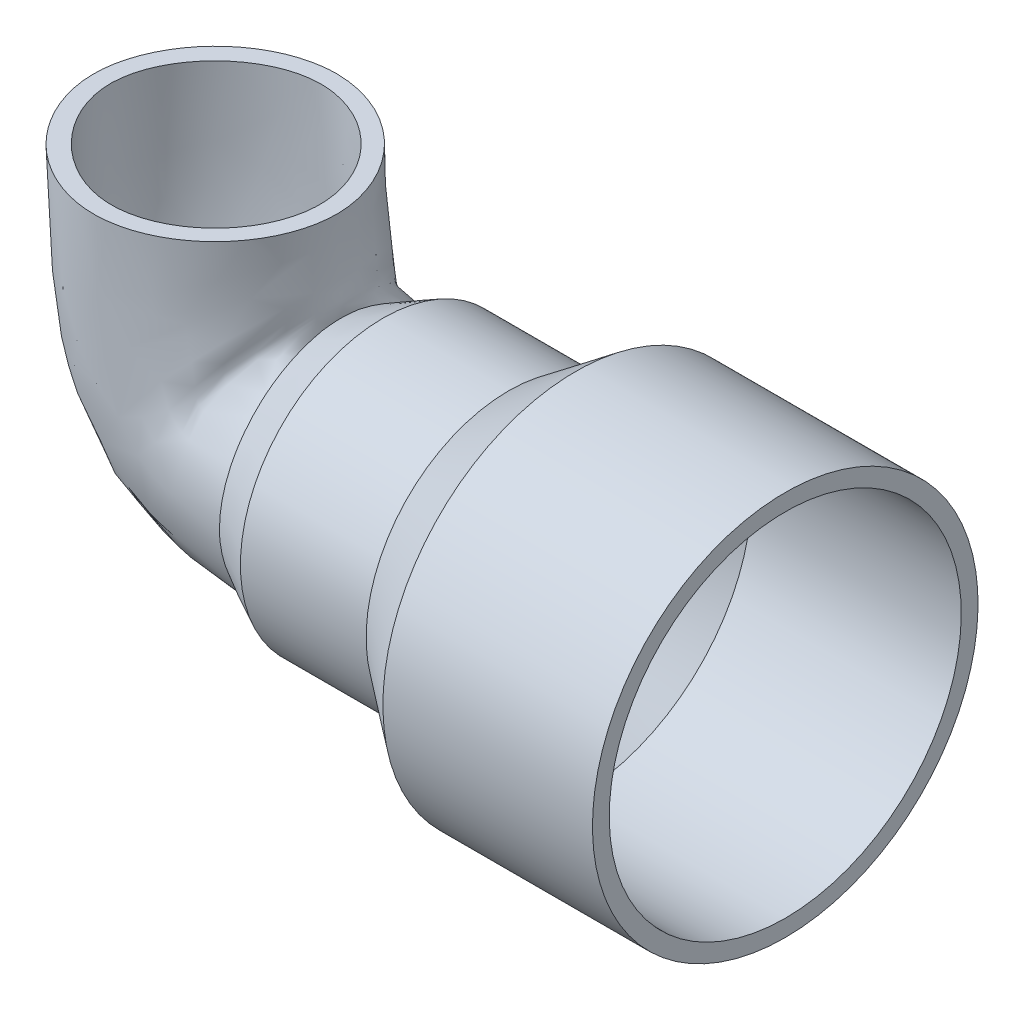
ISO-10303-21;
HEADER;
FILE_DESCRIPTION(('STEP AP214'),'2;1');
FILE_NAME('part.step','',(''),(''),'','','');
FILE_SCHEMA(('AUTOMOTIVE_DESIGN { 1 0 10303 214 1 1 1 1 }'));
ENDSEC;
DATA;
#1=APPLICATION_CONTEXT('core data for automotive mechanical design processes');
#2=APPLICATION_PROTOCOL_DEFINITION('international standard','automotive_design',2000,#1);
#3=PRODUCT_CONTEXT('',#1,'mechanical');
#4=PRODUCT('Part','Part','',(#3));
#5=PRODUCT_RELATED_PRODUCT_CATEGORY('part','',(#4));
#6=PRODUCT_DEFINITION_FORMATION('','',#4);
#7=PRODUCT_DEFINITION_CONTEXT('part definition',#1,'design');
#8=PRODUCT_DEFINITION('design','',#6,#7);
#9=PRODUCT_DEFINITION_SHAPE('','',#8);
#10=(LENGTH_UNIT() NAMED_UNIT(*) SI_UNIT(.MILLI.,.METRE.));
#11=(NAMED_UNIT(*) PLANE_ANGLE_UNIT() SI_UNIT($,.RADIAN.));
#12=(NAMED_UNIT(*) SI_UNIT($,.STERADIAN.) SOLID_ANGLE_UNIT());
#13=UNCERTAINTY_MEASURE_WITH_UNIT(LENGTH_MEASURE(1.E-05),#10,'distance_accuracy_value','');
#14=(GEOMETRIC_REPRESENTATION_CONTEXT(3) GLOBAL_UNCERTAINTY_ASSIGNED_CONTEXT((#13)) GLOBAL_UNIT_ASSIGNED_CONTEXT((#10,
#11,#12)) REPRESENTATION_CONTEXT('',''));
#15=CARTESIAN_POINT('',(0.,0.,0.));
#16=DIRECTION('',(0.,0.,1.));
#17=DIRECTION('',(1.,0.,0.));
#18=AXIS2_PLACEMENT_3D('',#15,#16,#17);
#19=CARTESIAN_POINT('',(-54.0909811019163,3.82106626767682,165.5));
#20=CARTESIAN_POINT('',(-54.0310372549395,1.02369924200767,165.5));
#21=CARTESIAN_POINT('',(-53.911149560986,-4.57103480933061,165.5));
#22=CARTESIAN_POINT('',(-52.629345334084,-12.3019522654296,165.5));
#23=CARTESIAN_POINT('',(-50.4057088278137,-18.0511037258101,165.5));
#24=CARTESIAN_POINT('',(-45.3207181918616,-20.6667759772876,165.5));
#25=CARTESIAN_POINT('',(-41.1675601318978,-21.0082144806449,165.5));
#26=CARTESIAN_POINT('',(-39.0909811019159,-21.1789337323236,165.5));
#27=CARTESIAN_POINT('',(-52.2247211897802,3.82106626767681,165.502112693678));
#28=CARTESIAN_POINT('',(-52.1826471418427,1.29788768821658,165.502112693678));
#29=CARTESIAN_POINT('',(-52.0984990459676,-3.7484694707039,165.502112693678));
#30=CARTESIAN_POINT('',(-50.9272942180678,-10.737597760018,165.502112693678));
#31=CARTESIAN_POINT('',(-49.5803796484308,-16.3305449875028,165.502112693678));
#32=CARTESIAN_POINT('',(-44.9275749922106,-18.8205603394971,165.502112693678));
#33=CARTESIAN_POINT('',(-41.0365123986808,-19.1486359932907,165.502112693678));
#34=CARTESIAN_POINT('',(-39.0909811019159,-19.3126738201875,165.502112693678));
#35=CARTESIAN_POINT('',(-49.4028908152659,3.82106626767681,166.146440373178));
#36=CARTESIAN_POINT('',(-49.3920612370021,1.7040867509622,166.146440373178));
#37=CARTESIAN_POINT('',(-49.3704020804747,-2.52987228246704,166.146440373178));
#38=CARTESIAN_POINT('',(-48.2254112881063,-8.33820572380235,166.146440373178));
#39=CARTESIAN_POINT('',(-48.3415181602521,-13.675620685343,166.146440373178));
#40=CARTESIAN_POINT('',(-44.3076500392752,-16.0066552098171,166.146440373178));
#41=CARTESIAN_POINT('',(-40.8298707477024,-16.3294473670545,166.146440373178));
#42=CARTESIAN_POINT('',(-39.0909811019159,-16.4908434456732,166.146440373178));
#43=CARTESIAN_POINT('',(-46.1208208950633,3.82106626767681,168.015818261705));
#44=CARTESIAN_POINT('',(-46.0802787626658,2.18016176972019,168.015818261705));
#45=CARTESIAN_POINT('',(-45.9991944978707,-1.10164722619306,168.015818261705));
#46=CARTESIAN_POINT('',(-45.751711648652,-5.98592436528117,168.015818261705));
#47=CARTESIAN_POINT('',(-44.3077479934382,-9.51084106247997,168.015818261705));
#48=CARTESIAN_POINT('',(-44.8001502158924,-13.0897001541132,168.015818261705));
#49=CARTESIAN_POINT('',(-40.9940374732414,-13.1690824016848,168.015818261705));
#50=CARTESIAN_POINT('',(-39.0909811019159,-13.2087735254706,168.015818261705));
#51=CARTESIAN_POINT('',(-41.7480524331799,3.82106626767681,171.662614315743));
#52=CARTESIAN_POINT('',(-41.7278732085778,2.75213965805734,171.662614315743));
#53=CARTESIAN_POINT('',(-41.6875147593734,0.614286438818412,171.662614315743));
#54=CARTESIAN_POINT('',(-41.6278034988023,-2.58496455646809,171.662614315743));
#55=CARTESIAN_POINT('',(-40.9347138850204,-5.21207753052342,171.662614315743));
#56=CARTESIAN_POINT('',(-41.5745157356822,-7.42790942252665,171.662614315743));
#57=CARTESIAN_POINT('',(-39.918825979838,-8.36663984990038,171.662614315743));
#58=CARTESIAN_POINT('',(-39.0909811019159,-8.83600506358723,171.662614315743));
#59=CARTESIAN_POINT('',(-37.8653240369053,3.8210662676768,180.));
#60=CARTESIAN_POINT('',(-37.8687619862568,3.09824114340324,180.));
#61=CARTESIAN_POINT('',(-37.8756378849597,1.65259089485612,180.));
#62=CARTESIAN_POINT('',(-37.6062665496293,-0.508620656871839,180.));
#63=CARTESIAN_POINT('',(-37.9018715933014,-2.34103187686233,180.));
#64=CARTESIAN_POINT('',(-36.6607330392985,-3.69078077673289,180.));
#65=CARTESIAN_POINT('',(-38.2808984143768,-4.53244470378602,180.));
#66=CARTESIAN_POINT('',(-39.0909811019159,-4.95327666731258,180.));
#67=CARTESIAN_POINT('',(-41.74805243318,3.8210662676768,188.337385684257));
#68=CARTESIAN_POINT('',(-41.7278732085695,2.75213965805774,188.337385684257));
#69=CARTESIAN_POINT('',(-41.6875147593487,0.614286438819609,188.337385684257));
#70=CARTESIAN_POINT('',(-41.6278034986661,-2.58496455643608,188.337385684257));
#71=CARTESIAN_POINT('',(-40.9347138849777,-5.21207753054738,188.337385684257));
#72=CARTESIAN_POINT('',(-41.5745157352457,-7.42790942237626,188.337385684257));
#73=CARTESIAN_POINT('',(-39.9188259796925,-8.36663984985024,188.337385684257));
#74=CARTESIAN_POINT('',(-39.0909811019159,-8.83600506358722,188.337385684257));
#75=CARTESIAN_POINT('',(-46.1208208950633,3.82106626767681,191.984181738295));
#76=CARTESIAN_POINT('',(-46.0802787626445,2.1801617697291,191.984181738295));
#77=CARTESIAN_POINT('',(-45.9991944978069,-1.10164722616631,191.984181738295));
#78=CARTESIAN_POINT('',(-45.7517116484983,-5.98592436521994,191.984181738295));
#79=CARTESIAN_POINT('',(-44.3077479931209,-9.51084106234392,191.984181738295));
#80=CARTESIAN_POINT('',(-44.8001502160003,-13.0897001541543,191.984181738295));
#81=CARTESIAN_POINT('',(-40.9940374732774,-13.1690824016985,191.984181738295));
#82=CARTESIAN_POINT('',(-39.0909811019159,-13.2087735254706,191.984181738295));
#83=CARTESIAN_POINT('',(-49.4028908152659,3.82106626767681,193.853559626822));
#84=CARTESIAN_POINT('',(-49.3920612369885,1.70408675096915,193.853559626822));
#85=CARTESIAN_POINT('',(-49.3704020804339,-2.52987228244618,193.853559626822));
#86=CARTESIAN_POINT('',(-48.2254112877266,-8.33820572361328,193.853559626822));
#87=CARTESIAN_POINT('',(-48.3415181604193,-13.6756206854134,193.853559626822));
#88=CARTESIAN_POINT('',(-44.3076500392163,-16.0066552097949,193.853559626822));
#89=CARTESIAN_POINT('',(-40.8298707476827,-16.3294473670471,193.853559626822));
#90=CARTESIAN_POINT('',(-39.0909811019159,-16.4908434456732,193.853559626822));
#91=CARTESIAN_POINT('',(-55.9871616891326,3.82106626767682,195.35699087899));
#92=CARTESIAN_POINT('',(-55.9034283482378,0.756288937923784,195.35699087899));
#93=CARTESIAN_POINT('',(-55.7359616664481,-5.37326572158228,195.35699087899));
#94=CARTESIAN_POINT('',(-54.5298047911839,-13.9367871415105,195.35699087899));
#95=CARTESIAN_POINT('',(-51.2321949659366,-19.8704440570311,195.35699087899));
#96=CARTESIAN_POINT('',(-45.7541415961569,-22.5724338457473,195.35699087899));
#97=CARTESIAN_POINT('',(-41.3120345999962,-22.907554161609,195.35699087899));
#98=CARTESIAN_POINT('',(-39.0909811019159,-23.0751143195399,195.35699087899));
#99=CARTESIAN_POINT('',(-65.1688578744117,3.82106626767683,191.093163420818));
#100=CARTESIAN_POINT('',(-65.0253740123928,-0.648544003542584,191.093163420818));
#101=CARTESIAN_POINT('',(-64.738406288355,-9.5877645459814,191.093163420818));
#102=CARTESIAN_POINT('',(-62.0480186653125,-21.4061578148045,191.093163420818));
#103=CARTESIAN_POINT('',(-55.3530560688982,-27.9793297839257,191.093163420818));
#104=CARTESIAN_POINT('',(-47.5184565713121,-31.5063008813918,191.093163420818));
#105=CARTESIAN_POINT('',(-41.9001395917146,-32.0066406303433,191.093163420818));
#106=CARTESIAN_POINT('',(-39.0909811019159,-32.256810504819,191.093163420818));
#107=CARTESIAN_POINT('',(-70.3020427156686,3.82106626767683,180.));
#108=CARTESIAN_POINT('',(-70.1328932660323,-1.45567807179847,180.));
#109=CARTESIAN_POINT('',(-69.7945943667597,-12.0091667507491,180.));
#110=CARTESIAN_POINT('',(-65.791463900737,-25.180019077184,180.));
#111=CARTESIAN_POINT('',(-57.6663406902442,-32.5539246486005,180.));
#112=CARTESIAN_POINT('',(-48.6963146336488,-36.5486388293174,180.));
#113=CARTESIAN_POINT('',(-42.2927589458269,-37.1095431738231,180.));
#114=CARTESIAN_POINT('',(-39.0909811019159,-37.3899953460759,180.));
#115=CARTESIAN_POINT('',(-65.1688578744117,3.82106626767683,168.906836579182));
#116=CARTESIAN_POINT('',(-65.0253740124796,-0.648544003606967,168.906836579182));
#117=CARTESIAN_POINT('',(-64.7384062886153,-9.58776454617456,168.906836579182));
#118=CARTESIAN_POINT('',(-62.0480186651829,-21.4061578147085,168.906836579182));
#119=CARTESIAN_POINT('',(-55.3530560688869,-27.9793297839269,168.906836579182));
#120=CARTESIAN_POINT('',(-47.5184565713208,-31.5063008813938,168.906836579182));
#121=CARTESIAN_POINT('',(-41.9001395917176,-32.0066406303439,168.906836579182));
#122=CARTESIAN_POINT('',(-39.0909811019159,-32.256810504819,168.906836579182));
#123=CARTESIAN_POINT('',(-57.8235009261884,3.82106626767682,165.495774612645));
#124=CARTESIAN_POINT('',(-57.7278174811333,0.475322349589872,165.495774612645));
#125=CARTESIAN_POINT('',(-57.5364505910229,-6.21616548658402,165.495774612645));
#126=CARTESIAN_POINT('',(-56.0334475661164,-15.4306612762529,165.495774612645));
#127=CARTESIAN_POINT('',(-52.0563671865794,-21.4922212024247,165.495774612645));
#128=CARTESIAN_POINT('',(-46.1070045911636,-24.3592072528685,165.495774612645));
#129=CARTESIAN_POINT('',(-41.4296555983318,-24.7273714553533,165.495774612645));
#130=CARTESIAN_POINT('',(-39.0909811019159,-24.9114535565957,165.495774612645));
#131=CARTESIAN_POINT('',(-54.0909811019163,3.82106626767682,165.5));
#132=CARTESIAN_POINT('',(-54.0310372549395,1.02369924200767,165.5));
#133=CARTESIAN_POINT('',(-53.911149560986,-4.57103480933061,165.5));
#134=CARTESIAN_POINT('',(-52.629345334084,-12.3019522654296,165.5));
#135=CARTESIAN_POINT('',(-50.4057088278137,-18.0511037258101,165.5));
#136=CARTESIAN_POINT('',(-45.3207181918616,-20.6667759772876,165.5));
#137=CARTESIAN_POINT('',(-41.1675601318978,-21.0082144806449,165.5));
#138=CARTESIAN_POINT('',(-39.0909811019159,-21.1789337323236,165.5));
#139=B_SPLINE_SURFACE_WITH_KNOTS('',3,3,((#19,#20,#21,#22,#23,#24,#25,#26),(#27,#28,#29,#30,#31,
#32,#33,#34),(#35,#36,#37,#38,#39,#40,#41,#42),(#43,#44,#45,#46,#47,#48,#49,#50),(#51,#52,#53,
#54,#55,#56,#57,#58),(#59,#60,#61,#62,#63,#64,#65,#66),(#67,#68,#69,#70,#71,#72,#73,#74),(#75,
#76,#77,#78,#79,#80,#81,#82),(#83,#84,#85,#86,#87,#88,#89,#90),(#91,#92,#93,#94,#95,#96,#97,
#98),(#99,#100,#101,#102,#103,#104,#105,#106),(#107,#108,#109,#110,#111,#112,#113,#114),(#115,
#116,#117,#118,#119,#120,#121,#122),(#123,#124,#125,#126,#127,#128,#129,#130),(#131,#132,#133,
#134,#135,#136,#137,#138)),.UNSPECIFIED.,.T.,.F.,.F.,(4,1,1,1,1,1,1,1,1,1,1,1,4),(4,1,1,1,1,4),
(0.,0.0625,0.09375,0.125,0.25,0.375,0.40625,0.4375,0.5,0.625,0.75,0.875,1.),(0.,0.25,0.5,0.75,
0.875,1.),.UNSPECIFIED.);
#140=CARTESIAN_POINT('',(-54.0909811019163,3.82106626767682,165.5));
#141=CARTESIAN_POINT('',(-52.2247211897802,3.82106626767681,165.502112693678));
#142=CARTESIAN_POINT('',(-49.4028908152659,3.82106626767681,166.146440373178));
#143=CARTESIAN_POINT('',(-46.1208208950633,3.82106626767681,168.015818261705));
#144=CARTESIAN_POINT('',(-41.7480524331799,3.82106626767681,171.662614315743));
#145=CARTESIAN_POINT('',(-37.8653240369053,3.8210662676768,180.));
#146=CARTESIAN_POINT('',(-41.74805243318,3.8210662676768,188.337385684257));
#147=CARTESIAN_POINT('',(-46.1208208950633,3.82106626767681,191.984181738295));
#148=CARTESIAN_POINT('',(-49.4028908152659,3.82106626767681,193.853559626822));
#149=CARTESIAN_POINT('',(-55.9871616891326,3.82106626767682,195.35699087899));
#150=CARTESIAN_POINT('',(-65.1688578744117,3.82106626767683,191.093163420818));
#151=CARTESIAN_POINT('',(-70.3020427156686,3.82106626767683,180.));
#152=CARTESIAN_POINT('',(-65.1688578744117,3.82106626767683,168.906836579182));
#153=CARTESIAN_POINT('',(-57.8235009261884,3.82106626767682,165.495774612645));
#154=CARTESIAN_POINT('',(-54.0909811019163,3.82106626767682,165.5));
#155=B_SPLINE_CURVE_WITH_KNOTS('',3,(#140,#141,#142,#143,#144,#145,#146,#147,#148,#149,#150,
#151,#152,#153,#154),.UNSPECIFIED.,.T.,.F.,(4,1,1,1,1,1,1,1,1,1,1,1,4),(0.,0.0625,0.09375,0.125,
0.25,0.375,0.40625,0.4375,0.5,0.625,0.75,0.875,1.),.UNSPECIFIED.);
#156=CARTESIAN_POINT('',(-54.0909811019163,3.82106626767682,165.5));
#157=VERTEX_POINT('',#156);
#158=EDGE_CURVE('E119',#157,#157,#155,.T.);
#159=CARTESIAN_POINT('',(-39.0909811019159,-21.1789337323236,165.5));
#160=CARTESIAN_POINT('',(-39.0909811019159,-24.9114535565957,165.495774612645));
#161=CARTESIAN_POINT('',(-39.0909811019159,-32.256810504819,168.906836579182));
#162=CARTESIAN_POINT('',(-39.0909811019159,-37.3899953460759,180.));
#163=CARTESIAN_POINT('',(-39.0909811019159,-32.256810504819,191.093163420818));
#164=CARTESIAN_POINT('',(-39.0909811019159,-23.0751143195399,195.35699087899));
#165=CARTESIAN_POINT('',(-39.0909811019159,-16.4908434456732,193.853559626822));
#166=CARTESIAN_POINT('',(-39.0909811019159,-13.2087735254706,191.984181738295));
#167=CARTESIAN_POINT('',(-39.0909811019159,-8.83600506358722,188.337385684257));
#168=CARTESIAN_POINT('',(-39.0909811019159,-4.95327666731258,180.));
#169=CARTESIAN_POINT('',(-39.0909811019159,-8.83600506358723,171.662614315743));
#170=CARTESIAN_POINT('',(-39.0909811019159,-13.2087735254706,168.015818261705));
#171=CARTESIAN_POINT('',(-39.0909811019159,-16.4908434456732,166.146440373178));
#172=CARTESIAN_POINT('',(-39.0909811019159,-19.3126738201875,165.502112693678));
#173=CARTESIAN_POINT('',(-39.0909811019159,-21.1789337323236,165.5));
#174=B_SPLINE_CURVE_WITH_KNOTS('',3,(#159,#160,#161,#162,#163,#164,#165,#166,#167,#168,#169,
#170,#171,#172,#173),.UNSPECIFIED.,.T.,.F.,(4,1,1,1,1,1,1,1,1,1,1,1,4),(0.,0.125,0.25,0.375,0.5,
0.5625,0.59375,0.625,0.75,0.875,0.90625,0.9375,1.),.UNSPECIFIED.);
#175=CARTESIAN_POINT('',(-39.0909811019159,-6.85748391383301,177.775915442367));
#176=VERTEX_POINT('',#175);
#177=CARTESIAN_POINT('',(-39.0909811019159,-21.2680140077665,165.500273634106));
#178=VERTEX_POINT('',#177);
#179=EDGE_CURVE('E178',#176,#178,#174,.T.);
#180=CARTESIAN_POINT('',(-39.0909811019159,-21.1789337323236,165.5));
#181=CARTESIAN_POINT('',(-39.0909811019159,-24.9114535565957,165.495774612645));
#182=CARTESIAN_POINT('',(-39.0909811019159,-32.256810504819,168.906836579182));
#183=CARTESIAN_POINT('',(-39.0909811019159,-37.3899953460759,180.));
#184=CARTESIAN_POINT('',(-39.0909811019159,-32.256810504819,191.093163420818));
#185=CARTESIAN_POINT('',(-39.0909811019159,-23.0751143195399,195.35699087899));
#186=CARTESIAN_POINT('',(-39.0909811019159,-16.4908434456732,193.853559626822));
#187=CARTESIAN_POINT('',(-39.0909811019159,-13.2087735254706,191.984181738295));
#188=CARTESIAN_POINT('',(-39.0909811019159,-8.83600506358722,188.337385684257));
#189=CARTESIAN_POINT('',(-39.0909811019159,-4.95327666731258,180.));
#190=CARTESIAN_POINT('',(-39.0909811019159,-8.83600506358723,171.662614315743));
#191=CARTESIAN_POINT('',(-39.0909811019159,-13.2087735254706,168.015818261705));
#192=CARTESIAN_POINT('',(-39.0909811019159,-16.4908434456732,166.146440373178));
#193=CARTESIAN_POINT('',(-39.0909811019159,-19.3126738201875,165.502112693678));
#194=CARTESIAN_POINT('',(-39.0909811019159,-21.1789337323236,165.5));
#195=B_SPLINE_CURVE_WITH_KNOTS('',3,(#180,#181,#182,#183,#184,#185,#186,#187,#188,#189,#190,
#191,#192,#193,#194),.UNSPECIFIED.,.T.,.F.,(4,1,1,1,1,1,1,1,1,1,1,1,4),(0.,0.125,0.25,0.375,0.5,
0.5625,0.59375,0.625,0.75,0.875,0.90625,0.9375,1.),.UNSPECIFIED.);
#196=CARTESIAN_POINT('',(-39.0909811019159,-35.6789337323236,180.));
#197=VERTEX_POINT('',#196);
#198=EDGE_CURVE('E70',#178,#197,#195,.T.);
#199=CARTESIAN_POINT('',(-39.0909811019159,-21.1789337323236,165.5));
#200=CARTESIAN_POINT('',(-39.0909811019159,-24.9114535565957,165.495774612645));
#201=CARTESIAN_POINT('',(-39.0909811019159,-32.256810504819,168.906836579182));
#202=CARTESIAN_POINT('',(-39.0909811019159,-37.3899953460759,180.));
#203=CARTESIAN_POINT('',(-39.0909811019159,-32.256810504819,191.093163420818));
#204=CARTESIAN_POINT('',(-39.0909811019159,-23.0751143195399,195.35699087899));
#205=CARTESIAN_POINT('',(-39.0909811019159,-16.4908434456732,193.853559626822));
#206=CARTESIAN_POINT('',(-39.0909811019159,-13.2087735254706,191.984181738295));
#207=CARTESIAN_POINT('',(-39.0909811019159,-8.83600506358722,188.337385684257));
#208=CARTESIAN_POINT('',(-39.0909811019159,-4.95327666731258,180.));
#209=CARTESIAN_POINT('',(-39.0909811019159,-8.83600506358723,171.662614315743));
#210=CARTESIAN_POINT('',(-39.0909811019159,-13.2087735254706,168.015818261705));
#211=CARTESIAN_POINT('',(-39.0909811019159,-16.4908434456732,166.146440373178));
#212=CARTESIAN_POINT('',(-39.0909811019159,-19.3126738201875,165.502112693678));
#213=CARTESIAN_POINT('',(-39.0909811019159,-21.1789337323236,165.5));
#214=B_SPLINE_CURVE_WITH_KNOTS('',3,(#199,#200,#201,#202,#203,#204,#205,#206,#207,#208,#209,
#210,#211,#212,#213),.UNSPECIFIED.,.T.,.F.,(4,1,1,1,1,1,1,1,1,1,1,1,4),(0.,0.125,0.25,0.375,0.5,
0.5625,0.59375,0.625,0.75,0.875,0.90625,0.9375,1.),.UNSPECIFIED.);
#215=CARTESIAN_POINT('',(-39.0909811019159,-21.3569047651503,194.499034670768));
#216=VERTEX_POINT('',#215);
#217=EDGE_CURVE('E75',#197,#216,#214,.T.);
#218=CARTESIAN_POINT('',(-39.0909811019159,-21.1789337323236,165.5));
#219=CARTESIAN_POINT('',(-39.0909811019159,-24.9114535565957,165.495774612645));
#220=CARTESIAN_POINT('',(-39.0909811019159,-32.256810504819,168.906836579182));
#221=CARTESIAN_POINT('',(-39.0909811019159,-37.3899953460759,180.));
#222=CARTESIAN_POINT('',(-39.0909811019159,-32.256810504819,191.093163420818));
#223=CARTESIAN_POINT('',(-39.0909811019159,-23.0751143195399,195.35699087899));
#224=CARTESIAN_POINT('',(-39.0909811019159,-16.4908434456732,193.853559626822));
#225=CARTESIAN_POINT('',(-39.0909811019159,-13.2087735254706,191.984181738295));
#226=CARTESIAN_POINT('',(-39.0909811019159,-8.83600506358722,188.337385684257));
#227=CARTESIAN_POINT('',(-39.0909811019159,-4.95327666731258,180.));
#228=CARTESIAN_POINT('',(-39.0909811019159,-8.83600506358723,171.662614315743));
#229=CARTESIAN_POINT('',(-39.0909811019159,-13.2087735254706,168.015818261705));
#230=CARTESIAN_POINT('',(-39.0909811019159,-16.4908434456732,166.146440373178));
#231=CARTESIAN_POINT('',(-39.0909811019159,-19.3126738201875,165.502112693678));
#232=CARTESIAN_POINT('',(-39.0909811019159,-21.1789337323236,165.5));
#233=B_SPLINE_CURVE_WITH_KNOTS('',3,(#218,#219,#220,#221,#222,#223,#224,#225,#226,#227,#228,
#229,#230,#231,#232),.UNSPECIFIED.,.T.,.F.,(4,1,1,1,1,1,1,1,1,1,1,1,4),(0.,0.125,0.25,0.375,0.5,
0.5625,0.59375,0.625,0.75,0.875,0.90625,0.9375,1.),.UNSPECIFIED.);
#234=CARTESIAN_POINT('',(-39.0909811019159,-6.85679942850274,182.224151614657));
#235=VERTEX_POINT('',#234);
#236=EDGE_CURVE('E266',#216,#235,#233,.T.);
#237=CARTESIAN_POINT('',(-39.0909811019159,-21.1789337323236,165.5));
#238=CARTESIAN_POINT('',(-39.0909811019159,-24.9114535565957,165.495774612645));
#239=CARTESIAN_POINT('',(-39.0909811019159,-32.256810504819,168.906836579182));
#240=CARTESIAN_POINT('',(-39.0909811019159,-37.3899953460759,180.));
#241=CARTESIAN_POINT('',(-39.0909811019159,-32.256810504819,191.093163420818));
#242=CARTESIAN_POINT('',(-39.0909811019159,-23.0751143195399,195.35699087899));
#243=CARTESIAN_POINT('',(-39.0909811019159,-16.4908434456732,193.853559626822));
#244=CARTESIAN_POINT('',(-39.0909811019159,-13.2087735254706,191.984181738295));
#245=CARTESIAN_POINT('',(-39.0909811019159,-8.83600506358722,188.337385684257));
#246=CARTESIAN_POINT('',(-39.0909811019159,-4.95327666731258,180.));
#247=CARTESIAN_POINT('',(-39.0909811019159,-8.83600506358723,171.662614315743));
#248=CARTESIAN_POINT('',(-39.0909811019159,-13.2087735254706,168.015818261705));
#249=CARTESIAN_POINT('',(-39.0909811019159,-16.4908434456732,166.146440373178));
#250=CARTESIAN_POINT('',(-39.0909811019159,-19.3126738201875,165.502112693678));
#251=CARTESIAN_POINT('',(-39.0909811019159,-21.1789337323236,165.5));
#252=B_SPLINE_CURVE_WITH_KNOTS('',3,(#237,#238,#239,#240,#241,#242,#243,#244,#245,#246,#247,
#248,#249,#250,#251),.UNSPECIFIED.,.T.,.F.,(4,1,1,1,1,1,1,1,1,1,1,1,4),(0.,0.125,0.25,0.375,0.5,
0.5625,0.59375,0.625,0.75,0.875,0.90625,0.9375,1.),.UNSPECIFIED.);
#253=CARTESIAN_POINT('',(-39.0909811019159,-6.67893373232353,180.));
#254=VERTEX_POINT('',#253);
#255=EDGE_CURVE('E277',#235,#254,#252,.T.);
#256=CARTESIAN_POINT('',(-39.0909811019159,-21.1789337323236,165.5));
#257=CARTESIAN_POINT('',(-39.0909811019159,-24.9114535565957,165.495774612645));
#258=CARTESIAN_POINT('',(-39.0909811019159,-32.256810504819,168.906836579182));
#259=CARTESIAN_POINT('',(-39.0909811019159,-37.3899953460759,180.));
#260=CARTESIAN_POINT('',(-39.0909811019159,-32.256810504819,191.093163420818));
#261=CARTESIAN_POINT('',(-39.0909811019159,-23.0751143195399,195.35699087899));
#262=CARTESIAN_POINT('',(-39.0909811019159,-16.4908434456732,193.853559626822));
#263=CARTESIAN_POINT('',(-39.0909811019159,-13.2087735254706,191.984181738295));
#264=CARTESIAN_POINT('',(-39.0909811019159,-8.83600506358722,188.337385684257));
#265=CARTESIAN_POINT('',(-39.0909811019159,-4.95327666731258,180.));
#266=CARTESIAN_POINT('',(-39.0909811019159,-8.83600506358723,171.662614315743));
#267=CARTESIAN_POINT('',(-39.0909811019159,-13.2087735254706,168.015818261705));
#268=CARTESIAN_POINT('',(-39.0909811019159,-16.4908434456732,166.146440373178));
#269=CARTESIAN_POINT('',(-39.0909811019159,-19.3126738201875,165.502112693678));
#270=CARTESIAN_POINT('',(-39.0909811019159,-21.1789337323236,165.5));
#271=B_SPLINE_CURVE_WITH_KNOTS('',3,(#256,#257,#258,#259,#260,#261,#262,#263,#264,#265,#266,
#267,#268,#269,#270),.UNSPECIFIED.,.T.,.F.,(4,1,1,1,1,1,1,1,1,1,1,1,4),(0.,0.125,0.25,0.375,0.5,
0.5625,0.59375,0.625,0.75,0.875,0.90625,0.9375,1.),.UNSPECIFIED.);
#272=EDGE_CURVE('E287',#254,#176,#271,.T.);
#273=ORIENTED_EDGE('',*,*,#158,.T.);
#274=EDGE_LOOP('',(#273));
#275=FACE_BOUND('',#274,.T.);
#276=ORIENTED_EDGE('',*,*,#179,.T.);
#277=ORIENTED_EDGE('',*,*,#198,.T.);
#278=ORIENTED_EDGE('',*,*,#217,.T.);
#279=ORIENTED_EDGE('',*,*,#236,.T.);
#280=ORIENTED_EDGE('',*,*,#255,.T.);
#281=ORIENTED_EDGE('',*,*,#272,.T.);
#282=EDGE_LOOP('',(#276,#277,#278,#279,#280,#281));
#283=FACE_BOUND('',#282,.T.);
#284=ADVANCED_FACE('F50',(#275,#283),#139,.T.);
#285=CARTESIAN_POINT('',(-54.0909811019163,3.82106626767682,180.));
#286=DIRECTION('',(0.,-1.,0.));
#287=DIRECTION('',(0.,0.,-1.));
#288=AXIS2_PLACEMENT_3D('',#285,#286,#287);
#289=PLANE('',#288);
#290=CARTESIAN_POINT('',(-54.0909811019163,3.82106626767682,167.5));
#291=CARTESIAN_POINT('',(-60.4214314732741,3.82106626767682,167.576952529125));
#292=CARTESIAN_POINT('',(-72.7605307305584,3.82106626767682,180.));
#293=CARTESIAN_POINT('',(-57.3366566589531,3.82106626767682,195.528809338594));
#294=CARTESIAN_POINT('',(-44.5148551735217,3.82106626767681,189.548143190531));
#295=CARTESIAN_POINT('',(-40.1290440661136,3.8210662676768,180.));
#296=CARTESIAN_POINT('',(-44.5148551735217,3.82106626767681,170.451856809469));
#297=CARTESIAN_POINT('',(-50.9257559162374,3.82106626767681,167.461523735438));
#298=CARTESIAN_POINT('',(-54.0909811019163,3.82106626767682,167.5));
#299=B_SPLINE_CURVE_WITH_KNOTS('',3,(#290,#291,#292,#293,#294,#295,#296,#297,#298),
.UNSPECIFIED.,.T.,.F.,(4,1,1,1,1,1,4),(0.,0.25,0.5,0.625,0.75,0.875,1.),.UNSPECIFIED.);
#300=CARTESIAN_POINT('',(-54.0909811019163,3.82106626767682,167.5));
#301=VERTEX_POINT('',#300);
#302=EDGE_CURVE('E12',#301,#301,#299,.T.);
#303=ORIENTED_EDGE('',*,*,#302,.F.);
#304=EDGE_LOOP('',(#303));
#305=FACE_BOUND('',#304,.T.);
#306=ORIENTED_EDGE('',*,*,#158,.F.);
#307=EDGE_LOOP('',(#306));
#308=FACE_BOUND('',#307,.T.);
#309=ADVANCED_FACE('F151',(#305,#308),#289,.F.);
#310=CARTESIAN_POINT('',(-54.0909811019163,3.82106626767682,167.5));
#311=CARTESIAN_POINT('',(-54.0373286055782,1.01992443223443,167.5));
#312=CARTESIAN_POINT('',(-53.9300236129021,-4.58235923865033,167.5));
#313=CARTESIAN_POINT('',(-52.7832115409669,-10.9776053299807,167.5));
#314=CARTESIAN_POINT('',(-51.3989707156459,-15.8137275027879,167.5));
#315=CARTESIAN_POINT('',(-49.5285677087211,-18.2331523901842,167.5));
#316=CARTESIAN_POINT('',(-47.1456471298855,-19.6367333339243,167.5));
#317=CARTESIAN_POINT('',(-44.9960414099132,-20.4719699158593,167.5));
#318=CARTESIAN_POINT('',(-42.8147587920818,-20.9340336799027,167.5));
#319=CARTESIAN_POINT('',(-40.8074154636455,-21.1462943493364,167.5));
#320=CARTESIAN_POINT('',(-39.6631258891591,-21.1680539379945,167.5));
#321=CARTESIAN_POINT('',(-39.0909811019159,-21.1789337323236,167.5));
#322=CARTESIAN_POINT('',(-60.4214314732741,3.82106626767682,167.576952529125));
#323=CARTESIAN_POINT('',(-60.3384603710993,0.0777113765365859,167.576952529125));
#324=CARTESIAN_POINT('',(-60.1725181667496,-7.40899840574389,167.576952529125));
#325=CARTESIAN_POINT('',(-58.3282611548105,-15.694134233641,167.576952529125));
#326=CARTESIAN_POINT('',(-55.9448808454159,-21.6957870609042,167.576952529125));
#327=CARTESIAN_POINT('',(-52.8359402092542,-24.4399834896585,167.576952529125));
#328=CARTESIAN_POINT('',(-49.2095080328509,-25.9022368934461,167.576952529125));
#329=CARTESIAN_POINT('',(-45.611407137207,-26.5268830669233,167.576952529125));
#330=CARTESIAN_POINT('',(-43.1386704322073,-27.1224823634212,167.576952529125));
#331=CARTESIAN_POINT('',(-41.0951083561216,-27.4561933902202,167.576952529125));
#332=CARTESIAN_POINT('',(-39.7590235199845,-27.491653865861,167.576952529125));
#333=CARTESIAN_POINT('',(-39.0909811019159,-27.5093841036814,167.576952529125));
#334=CARTESIAN_POINT('',(-72.7605307305584,3.82106626767682,180.));
#335=CARTESIAN_POINT('',(-72.567509600478,-1.84429564311659,180.));
#336=CARTESIAN_POINT('',(-72.1814673403172,-13.1750194647034,180.));
#337=CARTESIAN_POINT('',(-68.5506049633005,-24.9025739339835,180.));
#338=CARTESIAN_POINT('',(-62.0297610688233,-31.5933788345857,180.));
#339=CARTESIAN_POINT('',(-56.7434074470403,-34.7065222406947,180.));
#340=CARTESIAN_POINT('',(-52.4873450311993,-37.0748838614224,180.));
#341=CARTESIAN_POINT('',(-49.3977542292845,-38.7542637798289,180.));
#342=CARTESIAN_POINT('',(-45.5014794090076,-39.4950005023635,180.));
#343=CARTESIAN_POINT('',(-41.8617169565603,-39.7990736494742,180.));
#344=CARTESIAN_POINT('',(-40.0145597201307,-39.8320134571352,180.));
#345=CARTESIAN_POINT('',(-39.0909811019159,-39.8484833609657,180.));
#346=CARTESIAN_POINT('',(-57.3366566589531,3.82106626767682,195.528809338594));
#347=CARTESIAN_POINT('',(-57.2811980636578,0.558213131511517,195.528809338594));
#348=CARTESIAN_POINT('',(-57.1702808730673,-5.96749314081909,195.528809338594));
#349=CARTESIAN_POINT('',(-55.7726752022308,-13.3920243082552,195.528809338594));
#350=CARTESIAN_POINT('',(-54.4236607898169,-19.2213891176045,195.528809338594));
#351=CARTESIAN_POINT('',(-51.8590733999215,-21.8733488019399,195.528809338594));
#352=CARTESIAN_POINT('',(-48.3900487833556,-23.1090751514878,195.528809338594));
#353=CARTESIAN_POINT('',(-44.6648203642221,-23.47003788871,195.528809338594));
#354=CARTESIAN_POINT('',(-42.547968188003,-24.029352828684,195.528809338594));
#355=CARTESIAN_POINT('',(-40.9034562060127,-24.3704733254069,195.528809338594));
#356=CARTESIAN_POINT('',(-39.6951394699482,-24.4065639680425,195.528809338594));
#357=CARTESIAN_POINT('',(-39.0909811019159,-24.4246092893603,195.528809338594));
#358=CARTESIAN_POINT('',(-44.5148551735217,3.82106626767681,189.548143190531));
#359=CARTESIAN_POINT('',(-44.4923273818711,2.42384878871631,189.548143190531));
#360=CARTESIAN_POINT('',(-44.4472717985699,-0.370586169204679,189.548143190531));
#361=CARTESIAN_POINT('',(-44.2486982652858,-3.84665744772259,189.548143190531));
#362=CARTESIAN_POINT('',(-43.8283705116774,-6.52400632986328,189.548143190531));
#363=CARTESIAN_POINT('',(-43.8906895168691,-8.38612487890545,189.548143190531));
#364=CARTESIAN_POINT('',(-43.8373845733788,-9.89888795681164,189.548143190531));
#365=CARTESIAN_POINT('',(-44.7118967282818,-11.4189887919334,189.548143190531));
#366=CARTESIAN_POINT('',(-42.7576377560388,-11.6502658476045,189.548143190531));
#367=CARTESIAN_POINT('',(-40.4236818288018,-11.612216332382,189.548143190531));
#368=CARTESIAN_POINT('',(-39.5352146775445,-11.60594398008,189.548143190531));
#369=CARTESIAN_POINT('',(-39.0909811019159,-11.602807803929,189.548143190531));
#370=CARTESIAN_POINT('',(-40.1290440661136,3.8210662676768,180.));
#371=CARTESIAN_POINT('',(-40.1213876949674,2.89845905943384,180.));
#372=CARTESIAN_POINT('',(-40.1060749526751,1.05324464294792,180.));
#373=CARTESIAN_POINT('',(-39.9315059792753,-1.21644853922265,180.));
#374=CARTESIAN_POINT('',(-39.7877254915127,-3.05698525601308,180.));
#375=CARTESIAN_POINT('',(-39.4939014537447,-4.10464307836539,180.));
#376=CARTESIAN_POINT('',(-39.2152410417443,-4.91219894717218,180.));
#377=CARTESIAN_POINT('',(-38.6670560485274,-5.3487127352174,180.));
#378=CARTESIAN_POINT('',(-39.0784220271267,-6.13554652147806,180.));
#379=CARTESIAN_POINT('',(-40.7903974088736,-7.07607078755348,180.));
#380=CARTESIAN_POINT('',(-39.6574532042351,-7.17002139353173,180.));
#381=CARTESIAN_POINT('',(-39.0909811019159,-7.21699669652085,180.));
#382=CARTESIAN_POINT('',(-44.5148551735217,3.82106626767681,170.451856809469));
#383=CARTESIAN_POINT('',(-44.4923273818808,2.42384878871684,170.451856809469));
#384=CARTESIAN_POINT('',(-44.447271798599,-0.370586169203104,170.451856809469));
#385=CARTESIAN_POINT('',(-44.2486982654022,-3.84665744774574,170.451856809469));
#386=CARTESIAN_POINT('',(-43.8283705119577,-6.52400632997564,170.451856809469));
#387=CARTESIAN_POINT('',(-43.8906895171015,-8.3861248789946,170.451856809469));
#388=CARTESIAN_POINT('',(-43.8373845735417,-9.89888795687461,170.451856809469));
#389=CARTESIAN_POINT('',(-44.711896728345,-11.4189887919578,170.451856809469));
#390=CARTESIAN_POINT('',(-42.7576377560309,-11.6502658476014,170.451856809469));
#391=CARTESIAN_POINT('',(-40.4236818288031,-11.6122163323825,170.451856809469));
#392=CARTESIAN_POINT('',(-39.535214677545,-11.6059439800802,170.451856809469));
#393=CARTESIAN_POINT('',(-39.0909811019159,-11.602807803929,170.451856809469));
#394=CARTESIAN_POINT('',(-50.9257559162374,3.82106626767681,167.461523735438));
#395=CARTESIAN_POINT('',(-50.8867627228177,1.49103096008336,167.461523735438));
#396=CARTESIAN_POINT('',(-50.8087763359784,-3.16903965510355,167.461523735438));
#397=CARTESIAN_POINT('',(-50.0106867340451,-8.61934087815056,167.461523735438));
#398=CARTESIAN_POINT('',(-49.1260156507609,-12.8726977237297,167.461523735438));
#399=CARTESIAN_POINT('',(-47.8748814584546,-15.129736840447,167.461523735438));
#400=CARTESIAN_POINT('',(-46.1137166784028,-16.5039815541633,167.461523735438));
#401=CARTESIAN_POINT('',(-44.6883585462663,-17.4445133403273,167.461523735438));
#402=CARTESIAN_POINT('',(-42.6528029720191,-17.8398093381435,167.461523735438));
#403=CARTESIAN_POINT('',(-40.6635690174075,-17.9913448288946,167.461523735437));
#404=CARTESIAN_POINT('',(-39.6151770737464,-18.0062539740613,167.461523735438));
#405=CARTESIAN_POINT('',(-39.0909811019159,-18.0137085466446,167.461523735438));
#406=CARTESIAN_POINT('',(-54.0909811019163,3.82106626767682,167.5));
#407=CARTESIAN_POINT('',(-54.0373286055782,1.01992443223443,167.5));
#408=CARTESIAN_POINT('',(-53.9300236129021,-4.58235923865033,167.5));
#409=CARTESIAN_POINT('',(-52.7832115409669,-10.9776053299807,167.5));
#410=CARTESIAN_POINT('',(-51.3989707156459,-15.8137275027879,167.5));
#411=CARTESIAN_POINT('',(-49.5285677087211,-18.2331523901842,167.5));
#412=CARTESIAN_POINT('',(-47.1456471298855,-19.6367333339243,167.5));
#413=CARTESIAN_POINT('',(-44.9960414099132,-20.4719699158593,167.5));
#414=CARTESIAN_POINT('',(-42.8147587920818,-20.9340336799027,167.5));
#415=CARTESIAN_POINT('',(-40.8074154636455,-21.1462943493364,167.5));
#416=CARTESIAN_POINT('',(-39.6631258891591,-21.1680539379945,167.5));
#417=CARTESIAN_POINT('',(-39.0909811019159,-21.1789337323236,167.5));
#418=B_SPLINE_SURFACE_WITH_KNOTS('',3,3,((#310,#311,#312,#313,#314,#315,#316,#317,#318,#319,
#320,#321),(#322,#323,#324,#325,#326,#327,#328,#329,#330,#331,#332,#333),(#334,#335,#336,#337,
#338,#339,#340,#341,#342,#343,#344,#345),(#346,#347,#348,#349,#350,#351,#352,#353,#354,#355,
#356,#357),(#358,#359,#360,#361,#362,#363,#364,#365,#366,#367,#368,#369),(#370,#371,#372,#373,
#374,#375,#376,#377,#378,#379,#380,#381),(#382,#383,#384,#385,#386,#387,#388,#389,#390,#391,
#392,#393),(#394,#395,#396,#397,#398,#399,#400,#401,#402,#403,#404,#405),(#406,#407,#408,#409,
#410,#411,#412,#413,#414,#415,#416,#417)),.UNSPECIFIED.,.T.,.F.,.F.,(4,1,1,1,1,1,4),(4,1,1,1,1,
1,1,1,1,4),(0.,0.25,0.5,0.625,0.75,0.875,1.),(0.,0.25,0.5,0.625,0.75,0.8125,0.875,0.9375,
0.96875,1.),.UNSPECIFIED.);
#419=CARTESIAN_POINT('',(-39.0909811019159,-21.1789337323236,167.5));
#420=CARTESIAN_POINT('',(-39.0909811019159,-18.0137085466446,167.461523735438));
#421=CARTESIAN_POINT('',(-39.0909811019159,-11.602807803929,170.451856809469));
#422=CARTESIAN_POINT('',(-39.0909811019159,-7.21699669652085,180.));
#423=CARTESIAN_POINT('',(-39.0909811019159,-11.602807803929,189.548143190531));
#424=CARTESIAN_POINT('',(-39.0909811019159,-24.4246092893603,195.528809338594));
#425=CARTESIAN_POINT('',(-39.0909811019159,-39.8484833609657,180.));
#426=CARTESIAN_POINT('',(-39.0909811019159,-27.5093841036814,167.576952529125));
#427=CARTESIAN_POINT('',(-39.0909811019159,-21.1789337323236,167.5));
#428=B_SPLINE_CURVE_WITH_KNOTS('',3,(#419,#420,#421,#422,#423,#424,#425,#426,#427),
.UNSPECIFIED.,.T.,.F.,(4,1,1,1,1,1,4),(0.,0.125,0.25,0.375,0.5,0.75,1.),.UNSPECIFIED.);
#429=CARTESIAN_POINT('',(-39.0909811019159,-20.5667908441187,167.514997753928));
#430=VERTEX_POINT('',#429);
#431=CARTESIAN_POINT('',(-39.0909811019159,-33.6789337323236,180.));
#432=VERTEX_POINT('',#431);
#433=EDGE_CURVE('E107',#430,#432,#428,.F.);
#434=CARTESIAN_POINT('',(-39.0909811019159,-21.1789337323236,167.5));
#435=CARTESIAN_POINT('',(-39.0909811019159,-18.0137085466446,167.461523735438));
#436=CARTESIAN_POINT('',(-39.0909811019159,-11.602807803929,170.451856809469));
#437=CARTESIAN_POINT('',(-39.0909811019159,-7.21699669652085,180.));
#438=CARTESIAN_POINT('',(-39.0909811019159,-11.602807803929,189.548143190531));
#439=CARTESIAN_POINT('',(-39.0909811019159,-24.4246092893603,195.528809338594));
#440=CARTESIAN_POINT('',(-39.0909811019159,-39.8484833609657,180.));
#441=CARTESIAN_POINT('',(-39.0909811019159,-27.5093841036814,167.576952529125));
#442=CARTESIAN_POINT('',(-39.0909811019159,-21.1789337323236,167.5));
#443=B_SPLINE_CURVE_WITH_KNOTS('',3,(#434,#435,#436,#437,#438,#439,#440,#441,#442),
.UNSPECIFIED.,.T.,.F.,(4,1,1,1,1,1,4),(0.,0.125,0.25,0.375,0.5,0.75,1.),.UNSPECIFIED.);
#444=CARTESIAN_POINT('',(-39.0909811019159,-8.67893373232356,180.));
#445=VERTEX_POINT('',#444);
#446=EDGE_CURVE('E63',#445,#430,#443,.F.);
#447=CARTESIAN_POINT('',(-39.0909811019159,-21.1789337323236,167.5));
#448=CARTESIAN_POINT('',(-39.0909811019159,-18.0137085466446,167.461523735438));
#449=CARTESIAN_POINT('',(-39.0909811019159,-11.602807803929,170.451856809469));
#450=CARTESIAN_POINT('',(-39.0909811019159,-7.21699669652085,180.));
#451=CARTESIAN_POINT('',(-39.0909811019159,-11.602807803929,189.548143190531));
#452=CARTESIAN_POINT('',(-39.0909811019159,-24.4246092893603,195.528809338594));
#453=CARTESIAN_POINT('',(-39.0909811019159,-39.8484833609657,180.));
#454=CARTESIAN_POINT('',(-39.0909811019159,-27.5093841036814,167.576952529125));
#455=CARTESIAN_POINT('',(-39.0909811019159,-21.1789337323236,167.5));
#456=B_SPLINE_CURVE_WITH_KNOTS('',3,(#447,#448,#449,#450,#451,#452,#453,#454,#455),
.UNSPECIFIED.,.T.,.F.,(4,1,1,1,1,1,4),(0.,0.125,0.25,0.375,0.5,0.75,1.),.UNSPECIFIED.);
#457=CARTESIAN_POINT('',(-39.0909811019159,-19.9558931733349,192.443385902027));
#458=VERTEX_POINT('',#457);
#459=EDGE_CURVE('E118',#458,#445,#456,.F.);
#460=CARTESIAN_POINT('',(-39.0909811019159,-21.1789337323236,167.5));
#461=CARTESIAN_POINT('',(-39.0909811019159,-18.0137085466446,167.461523735438));
#462=CARTESIAN_POINT('',(-39.0909811019159,-11.602807803929,170.451856809469));
#463=CARTESIAN_POINT('',(-39.0909811019159,-7.21699669652085,180.));
#464=CARTESIAN_POINT('',(-39.0909811019159,-11.602807803929,189.548143190531));
#465=CARTESIAN_POINT('',(-39.0909811019159,-24.4246092893603,195.528809338594));
#466=CARTESIAN_POINT('',(-39.0909811019159,-39.8484833609657,180.));
#467=CARTESIAN_POINT('',(-39.0909811019159,-27.5093841036814,167.576952529125));
#468=CARTESIAN_POINT('',(-39.0909811019159,-21.1789337323236,167.5));
#469=B_SPLINE_CURVE_WITH_KNOTS('',3,(#460,#461,#462,#463,#464,#465,#466,#467,#468),
.UNSPECIFIED.,.T.,.F.,(4,1,1,1,1,1,4),(0.,0.125,0.25,0.375,0.5,0.75,1.),.UNSPECIFIED.);
#470=EDGE_CURVE('E111',#432,#458,#469,.F.);
#471=ORIENTED_EDGE('',*,*,#302,.T.);
#472=EDGE_LOOP('',(#471));
#473=FACE_BOUND('',#472,.T.);
#474=ORIENTED_EDGE('',*,*,#433,.F.);
#475=ORIENTED_EDGE('',*,*,#446,.F.);
#476=ORIENTED_EDGE('',*,*,#459,.F.);
#477=ORIENTED_EDGE('',*,*,#470,.F.);
#478=EDGE_LOOP('',(#474,#475,#476,#477));
#479=FACE_BOUND('',#478,.T.);
#480=ADVANCED_FACE('F123',(#473,#479),#418,.T.);
#481=CARTESIAN_POINT('',(-34.0909811019159,-21.1789337323236,180.));
#482=DIRECTION('',(1.,0.,0.));
#483=DIRECTION('',(0.,1.,0.));
#484=AXIS2_PLACEMENT_3D('',#481,#482,#483);
#485=CONICAL_SURFACE('',#484,17.,0.463647609000807);
#486=ORIENTED_EDGE('',*,*,#217,.F.);
#487=ORIENTED_EDGE('',*,*,#198,.F.);
#488=ORIENTED_EDGE('',*,*,#179,.F.);
#489=ORIENTED_EDGE('',*,*,#272,.F.);
#490=ORIENTED_EDGE('',*,*,#255,.F.);
#491=ORIENTED_EDGE('',*,*,#236,.F.);
#492=EDGE_LOOP('',(#486,#487,#488,#489,#490,#491));
#493=FACE_BOUND('',#492,.T.);
#494=CARTESIAN_POINT('',(-34.0909811019159,-21.1789337323236,180.));
#495=DIRECTION('',(-1.,0.,0.));
#496=DIRECTION('',(0.,-1.,0.));
#497=AXIS2_PLACEMENT_3D('',#494,#495,#496);
#498=CIRCLE('',#497,17.);
#499=CARTESIAN_POINT('',(-34.0909811019159,-38.1789337323236,180.));
#500=VERTEX_POINT('',#499);
#501=EDGE_CURVE('E296',#500,#500,#498,.T.);
#502=ORIENTED_EDGE('',*,*,#501,.T.);
#503=EDGE_LOOP('',(#502));
#504=FACE_BOUND('',#503,.T.);
#505=ADVANCED_FACE('F150',(#493,#504),#485,.T.);
#506=CARTESIAN_POINT('',(-39.0909811019159,-21.1789337323236,180.));
#507=DIRECTION('',(-1.,0.,0.));
#508=DIRECTION('',(0.,-1.,0.));
#509=AXIS2_PLACEMENT_3D('',#506,#507,#508);
#510=CYLINDRICAL_SURFACE('',#509,17.);
#511=ORIENTED_EDGE('',*,*,#501,.F.);
#512=EDGE_LOOP('',(#511));
#513=FACE_BOUND('',#512,.T.);
#514=CARTESIAN_POINT('',(-19.0909811019159,-21.1789337323236,180.));
#515=DIRECTION('',(-1.,0.,0.));
#516=DIRECTION('',(0.,-1.,0.));
#517=AXIS2_PLACEMENT_3D('',#514,#515,#516);
#518=CIRCLE('',#517,17.);
#519=CARTESIAN_POINT('',(-19.0909811019159,-38.1789337323236,180.));
#520=VERTEX_POINT('',#519);
#521=EDGE_CURVE('E316',#520,#520,#518,.T.);
#522=ORIENTED_EDGE('',*,*,#521,.T.);
#523=EDGE_LOOP('',(#522));
#524=FACE_BOUND('',#523,.T.);
#525=ADVANCED_FACE('F320',(#513,#524),#510,.T.);
#526=CARTESIAN_POINT('',(-39.0909811019159,-21.1789337323236,180.));
#527=DIRECTION('',(-1.,0.,0.));
#528=DIRECTION('',(0.,-1.,0.));
#529=AXIS2_PLACEMENT_3D('',#526,#527,#528);
#530=CYLINDRICAL_SURFACE('',#529,15.);
#531=CARTESIAN_POINT('',(-19.0909811019159,-21.1789337323236,180.));
#532=DIRECTION('',(-1.,0.,0.));
#533=DIRECTION('',(0.,-1.,0.));
#534=AXIS2_PLACEMENT_3D('',#531,#532,#533);
#535=CIRCLE('',#534,15.);
#536=CARTESIAN_POINT('',(-19.0909811019159,-36.1789337323236,180.));
#537=VERTEX_POINT('',#536);
#538=EDGE_CURVE('E298',#537,#537,#535,.T.);
#539=ORIENTED_EDGE('',*,*,#538,.F.);
#540=EDGE_LOOP('',(#539));
#541=FACE_BOUND('',#540,.T.);
#542=CARTESIAN_POINT('',(-34.0909811019159,-21.1789337323236,180.));
#543=DIRECTION('',(-1.,0.,0.));
#544=DIRECTION('',(0.,-1.,0.));
#545=AXIS2_PLACEMENT_3D('',#542,#543,#544);
#546=CIRCLE('',#545,15.);
#547=CARTESIAN_POINT('',(-34.0909811019159,-36.1789337323236,180.));
#548=VERTEX_POINT('',#547);
#549=EDGE_CURVE('E125',#548,#548,#546,.T.);
#550=ORIENTED_EDGE('',*,*,#549,.T.);
#551=EDGE_LOOP('',(#550));
#552=FACE_BOUND('',#551,.T.);
#553=ADVANCED_FACE('F221',(#541,#552),#530,.F.);
#554=CARTESIAN_POINT('',(-39.0909811019159,-21.1789337323236,180.));
#555=DIRECTION('',(1.,0.,0.));
#556=DIRECTION('',(0.,1.,0.));
#557=AXIS2_PLACEMENT_3D('',#554,#555,#556);
#558=CONICAL_SURFACE('',#557,12.5,0.463647609000807);
#559=ORIENTED_EDGE('',*,*,#549,.F.);
#560=EDGE_LOOP('',(#559));
#561=FACE_BOUND('',#560,.T.);
#562=ORIENTED_EDGE('',*,*,#470,.T.);
#563=ORIENTED_EDGE('',*,*,#459,.T.);
#564=ORIENTED_EDGE('',*,*,#446,.T.);
#565=ORIENTED_EDGE('',*,*,#433,.T.);
#566=EDGE_LOOP('',(#562,#563,#564,#565));
#567=FACE_BOUND('',#566,.T.);
#568=ADVANCED_FACE('F110',(#561,#567),#558,.F.);
#569=CARTESIAN_POINT('',(-19.0909811019159,-21.1789337323236,180.));
#570=DIRECTION('',(1.,0.,0.));
#571=DIRECTION('',(0.,1.,0.));
#572=AXIS2_PLACEMENT_3D('',#569,#570,#571);
#573=CONICAL_SURFACE('',#572,15.,0.643501108793284);
#574=CARTESIAN_POINT('',(-11.0909811019159,-21.1789337323236,180.));
#575=DIRECTION('',(-1.,0.,0.));
#576=DIRECTION('',(0.,-1.,0.));
#577=AXIS2_PLACEMENT_3D('',#574,#575,#576);
#578=CIRCLE('',#577,21.);
#579=CARTESIAN_POINT('',(-11.0909811019159,-42.1789337323236,180.));
#580=VERTEX_POINT('',#579);
#581=EDGE_CURVE('E126',#580,#580,#578,.T.);
#582=ORIENTED_EDGE('',*,*,#581,.F.);
#583=EDGE_LOOP('',(#582));
#584=FACE_BOUND('',#583,.T.);
#585=ORIENTED_EDGE('',*,*,#538,.T.);
#586=EDGE_LOOP('',(#585));
#587=FACE_BOUND('',#586,.T.);
#588=ADVANCED_FACE('F220',(#584,#587),#573,.F.);
#589=CARTESIAN_POINT('',(-19.0909811019159,-21.1789337323236,180.));
#590=DIRECTION('',(-1.,0.,0.));
#591=DIRECTION('',(0.,-1.,0.));
#592=AXIS2_PLACEMENT_3D('',#589,#590,#591);
#593=CYLINDRICAL_SURFACE('',#592,21.);
#594=CARTESIAN_POINT('',(13.9090188980841,-21.1789337323236,180.));
#595=DIRECTION('',(-1.,0.,0.));
#596=DIRECTION('',(0.,-1.,0.));
#597=AXIS2_PLACEMENT_3D('',#594,#595,#596);
#598=CIRCLE('',#597,21.);
#599=CARTESIAN_POINT('',(13.9090188980841,-42.1789337323236,180.));
#600=VERTEX_POINT('',#599);
#601=EDGE_CURVE('E307',#600,#600,#598,.T.);
#602=ORIENTED_EDGE('',*,*,#601,.F.);
#603=EDGE_LOOP('',(#602));
#604=FACE_BOUND('',#603,.T.);
#605=ORIENTED_EDGE('',*,*,#581,.T.);
#606=EDGE_LOOP('',(#605));
#607=FACE_BOUND('',#606,.T.);
#608=ADVANCED_FACE('F337',(#604,#607),#593,.F.);
#609=CARTESIAN_POINT('',(13.9090188980841,1.82106626767644,180.));
#610=DIRECTION('',(-1.,0.,0.));
#611=DIRECTION('',(0.,-1.,0.));
#612=AXIS2_PLACEMENT_3D('',#609,#610,#611);
#613=PLANE('',#612);
#614=CARTESIAN_POINT('',(13.9090188980841,-21.1789337323236,180.));
#615=DIRECTION('',(-1.,0.,0.));
#616=DIRECTION('',(0.,-1.,0.));
#617=AXIS2_PLACEMENT_3D('',#614,#615,#616);
#618=CIRCLE('',#617,23.);
#619=CARTESIAN_POINT('',(13.9090188980841,-44.1789337323236,180.));
#620=VERTEX_POINT('',#619);
#621=EDGE_CURVE('E310',#620,#620,#618,.T.);
#622=ORIENTED_EDGE('',*,*,#621,.F.);
#623=EDGE_LOOP('',(#622));
#624=FACE_BOUND('',#623,.T.);
#625=ORIENTED_EDGE('',*,*,#601,.T.);
#626=EDGE_LOOP('',(#625));
#627=FACE_BOUND('',#626,.T.);
#628=ADVANCED_FACE('F331',(#624,#627),#613,.F.);
#629=CARTESIAN_POINT('',(-19.0909811019159,-21.1789337323236,180.));
#630=DIRECTION('',(-1.,0.,0.));
#631=DIRECTION('',(0.,-1.,0.));
#632=AXIS2_PLACEMENT_3D('',#629,#630,#631);
#633=CYLINDRICAL_SURFACE('',#632,23.);
#634=CARTESIAN_POINT('',(-11.0909811019159,-21.1789337323236,180.));
#635=DIRECTION('',(-1.,0.,0.));
#636=DIRECTION('',(0.,-1.,0.));
#637=AXIS2_PLACEMENT_3D('',#634,#635,#636);
#638=CIRCLE('',#637,23.);
#639=CARTESIAN_POINT('',(-11.0909811019159,-44.1789337323236,180.));
#640=VERTEX_POINT('',#639);
#641=EDGE_CURVE('E313',#640,#640,#638,.T.);
#642=ORIENTED_EDGE('',*,*,#641,.F.);
#643=EDGE_LOOP('',(#642));
#644=FACE_BOUND('',#643,.T.);
#645=ORIENTED_EDGE('',*,*,#621,.T.);
#646=EDGE_LOOP('',(#645));
#647=FACE_BOUND('',#646,.T.);
#648=ADVANCED_FACE('F325',(#644,#647),#633,.T.);
#649=CARTESIAN_POINT('',(-11.0909811019159,-21.1789337323236,180.));
#650=DIRECTION('',(1.,0.,0.));
#651=DIRECTION('',(0.,1.,0.));
#652=AXIS2_PLACEMENT_3D('',#649,#650,#651);
#653=CONICAL_SURFACE('',#652,23.,0.643501108793284);
#654=ORIENTED_EDGE('',*,*,#521,.F.);
#655=EDGE_LOOP('',(#654));
#656=FACE_BOUND('',#655,.T.);
#657=ORIENTED_EDGE('',*,*,#641,.T.);
#658=EDGE_LOOP('',(#657));
#659=FACE_BOUND('',#658,.T.);
#660=ADVANCED_FACE('F322',(#656,#659),#653,.T.);
#661=CLOSED_SHELL('',(#284,#309,#480,#505,#525,#553,#568,#588,#608,#628,#648,#660));
#662=MANIFOLD_SOLID_BREP('B2',#661);
#663=ADVANCED_BREP_SHAPE_REPRESENTATION('',(#18,#662),#14);
#664=SHAPE_DEFINITION_REPRESENTATION(#9,#663);
ENDSEC;
END-ISO-10303-21;
